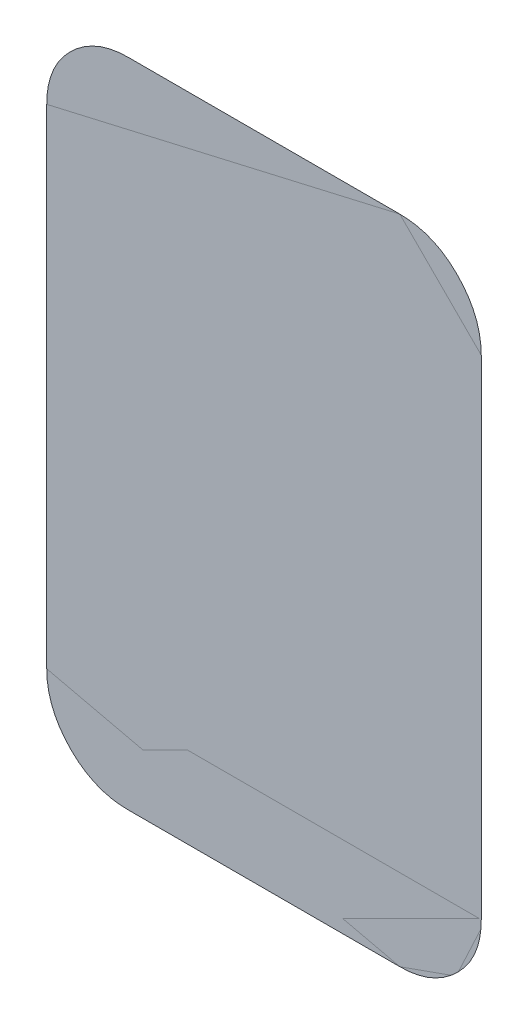
ISO-10303-21;
HEADER;
FILE_DESCRIPTION(('STEP AP214'),'2;1');
FILE_NAME('part.step','',(''),(''),'','','');
FILE_SCHEMA(('AUTOMOTIVE_DESIGN { 1 0 10303 214 1 1 1 1 }'));
ENDSEC;
DATA;
#1=APPLICATION_CONTEXT('core data for automotive mechanical design processes');
#2=APPLICATION_PROTOCOL_DEFINITION('international standard','automotive_design',2000,#1);
#3=PRODUCT_CONTEXT('',#1,'mechanical');
#4=PRODUCT('Part','Part','',(#3));
#5=PRODUCT_RELATED_PRODUCT_CATEGORY('part','',(#4));
#6=PRODUCT_DEFINITION_FORMATION('','',#4);
#7=PRODUCT_DEFINITION_CONTEXT('part definition',#1,'design');
#8=PRODUCT_DEFINITION('design','',#6,#7);
#9=PRODUCT_DEFINITION_SHAPE('','',#8);
#10=(LENGTH_UNIT() NAMED_UNIT(*) SI_UNIT(.MILLI.,.METRE.));
#11=(NAMED_UNIT(*) PLANE_ANGLE_UNIT() SI_UNIT($,.RADIAN.));
#12=(NAMED_UNIT(*) SI_UNIT($,.STERADIAN.) SOLID_ANGLE_UNIT());
#13=UNCERTAINTY_MEASURE_WITH_UNIT(LENGTH_MEASURE(1.E-05),#10,'distance_accuracy_value','');
#14=(GEOMETRIC_REPRESENTATION_CONTEXT(3) GLOBAL_UNCERTAINTY_ASSIGNED_CONTEXT((#13)) GLOBAL_UNIT_ASSIGNED_CONTEXT((#10,
#11,#12)) REPRESENTATION_CONTEXT('',''));
#15=CARTESIAN_POINT('',(0.,0.,0.));
#16=DIRECTION('',(0.,0.,1.));
#17=DIRECTION('',(1.,0.,0.));
#18=AXIS2_PLACEMENT_3D('',#15,#16,#17);
#19=CARTESIAN_POINT('',(15.410999937155,32.749999730201,0.0127));
#20=DIRECTION('',(0.,0.,1.));
#21=DIRECTION('',(1.,0.,0.));
#22=AXIS2_PLACEMENT_3D('',#19,#20,#21);
#23=PLANE('',#22);
#24=CARTESIAN_POINT('',(15.919000244141,33.321499023437,0.0128));
#25=CARTESIAN_POINT('',(15.9189946891649,33.3994216710256,0.0128));
#26=CARTESIAN_POINT('',(15.8631999653755,33.4561992329535,0.0128));
#27=CARTESIAN_POINT('',(15.8083712029976,33.5119938178159,0.0128));
#28=CARTESIAN_POINT('',(15.728499755859,33.511999511719,0.0128));
#29=B_SPLINE_CURVE_WITH_KNOTS('',2,(#24,#25,#26,#27,#28),.UNSPECIFIED.,.F.,.F.,(3,2,3),(0.,0.5,
1.),.UNSPECIFIED.);
#30=CARTESIAN_POINT('',(15.919000244141,33.321499023437,0.01275));
#31=VERTEX_POINT('',#30);
#32=CARTESIAN_POINT('',(15.728499755859,33.511999511719,0.01275));
#33=VERTEX_POINT('',#32);
#34=EDGE_CURVE('E74',#31,#33,#29,.T.);
#35=ORIENTED_EDGE('',*,*,#34,.F.);
#36=CARTESIAN_POINT('',(15.919000244141,32.178498535156,0.0128));
#37=DIRECTION('',(0.,1.,0.));
#38=VECTOR('',#37,1.);
#39=LINE('',#36,#38);
#40=CARTESIAN_POINT('',(15.919000244141,32.178498535156,0.01275));
#41=VERTEX_POINT('',#40);
#42=EDGE_CURVE('E69',#41,#31,#39,.T.);
#43=ORIENTED_EDGE('',*,*,#42,.F.);
#44=CARTESIAN_POINT('',(15.728499755859,31.988000488281,0.0128));
#45=CARTESIAN_POINT('',(15.8064216986689,31.9880060432884,0.0128));
#46=CARTESIAN_POINT('',(15.863199102215,32.043799903928,0.0128));
#47=CARTESIAN_POINT('',(15.9189935265977,32.0986278133435,0.0128));
#48=CARTESIAN_POINT('',(15.919000244141,32.178498535156,0.0128));
#49=B_SPLINE_CURVE_WITH_KNOTS('',2,(#44,#45,#46,#47,#48),.UNSPECIFIED.,.F.,.F.,(3,2,3),(0.,0.5,
1.),.UNSPECIFIED.);
#50=CARTESIAN_POINT('',(15.728499755859,31.988000488281,0.01275));
#51=VERTEX_POINT('',#50);
#52=EDGE_CURVE('E11',#51,#41,#49,.T.);
#53=ORIENTED_EDGE('',*,*,#52,.F.);
#54=CARTESIAN_POINT('',(15.093499755859,31.988000488281,0.0128));
#55=DIRECTION('',(1.,0.,0.));
#56=VECTOR('',#55,1.);
#57=LINE('',#54,#56);
#58=CARTESIAN_POINT('',(15.093499755859,31.988000488281,0.01275));
#59=VERTEX_POINT('',#58);
#60=EDGE_CURVE('E29',#59,#51,#57,.T.);
#61=ORIENTED_EDGE('',*,*,#60,.F.);
#62=CARTESIAN_POINT('',(14.902999267578,32.178498535156,0.0128));
#63=CARTESIAN_POINT('',(14.9030058211753,32.1005765924085,0.0128));
#64=CARTESIAN_POINT('',(14.958800409473,32.0437999038965,0.0128));
#65=CARTESIAN_POINT('',(15.0136290339469,31.9880061821705,0.0128));
#66=CARTESIAN_POINT('',(15.093499755859,31.988000488281,0.0128));
#67=B_SPLINE_CURVE_WITH_KNOTS('',2,(#62,#63,#64,#65,#66),.UNSPECIFIED.,.F.,.F.,(3,2,3),(0.,0.5,
1.),.UNSPECIFIED.);
#68=CARTESIAN_POINT('',(14.902999267578,32.178498535156,0.01275));
#69=VERTEX_POINT('',#68);
#70=EDGE_CURVE('E168',#69,#59,#67,.T.);
#71=ORIENTED_EDGE('',*,*,#70,.F.);
#72=CARTESIAN_POINT('',(14.902999267578,33.321499023437,0.0128));
#73=DIRECTION('',(0.,-1.,0.));
#74=VECTOR('',#73,1.);
#75=LINE('',#72,#74);
#76=CARTESIAN_POINT('',(14.902999267578,33.321499023437,0.01275));
#77=VERTEX_POINT('',#76);
#78=EDGE_CURVE('E156',#77,#69,#75,.T.);
#79=ORIENTED_EDGE('',*,*,#78,.F.);
#80=CARTESIAN_POINT('',(15.093499755859,33.511999511719,0.0128));
#81=CARTESIAN_POINT('',(15.0155777170254,33.5119924774332,0.0128));
#82=CARTESIAN_POINT('',(14.9588006056025,33.4561981736945,0.0128));
#83=CARTESIAN_POINT('',(14.9030064777863,33.4013698381875,0.0128));
#84=CARTESIAN_POINT('',(14.902999267578,33.321499023437,0.0128));
#85=B_SPLINE_CURVE_WITH_KNOTS('',2,(#80,#81,#82,#83,#84),.UNSPECIFIED.,.F.,.F.,(3,2,3),(0.,0.5,
1.),.UNSPECIFIED.);
#86=CARTESIAN_POINT('',(15.093499755859,33.511999511719,0.01275));
#87=VERTEX_POINT('',#86);
#88=EDGE_CURVE('E149',#87,#77,#85,.T.);
#89=ORIENTED_EDGE('',*,*,#88,.F.);
#90=CARTESIAN_POINT('',(15.728499755859,33.511999511719,0.0128));
#91=DIRECTION('',(-1.,0.,0.));
#92=VECTOR('',#91,1.);
#93=LINE('',#90,#92);
#94=EDGE_CURVE('E147',#33,#87,#93,.T.);
#95=ORIENTED_EDGE('',*,*,#94,.F.);
#96=EDGE_LOOP('',(#35,#43,#53,#61,#71,#79,#89,#95));
#97=FACE_BOUND('',#96,.T.);
#98=ADVANCED_FACE('F17',(#97),#23,.F.);
#99=CARTESIAN_POINT('',(15.410999937155,32.749999730201,0.0128));
#100=DIRECTION('',(0.,0.,1.));
#101=DIRECTION('',(1.,0.,0.));
#102=AXIS2_PLACEMENT_3D('',#99,#100,#101);
#103=PLANE('',#102);
#104=ORIENTED_EDGE('',*,*,#42,.T.);
#105=ORIENTED_EDGE('',*,*,#34,.T.);
#106=ORIENTED_EDGE('',*,*,#94,.T.);
#107=ORIENTED_EDGE('',*,*,#88,.T.);
#108=ORIENTED_EDGE('',*,*,#78,.T.);
#109=ORIENTED_EDGE('',*,*,#70,.T.);
#110=ORIENTED_EDGE('',*,*,#60,.T.);
#111=ORIENTED_EDGE('',*,*,#52,.T.);
#112=EDGE_LOOP('',(#104,#105,#106,#107,#108,#109,#110,#111));
#113=FACE_BOUND('',#112,.T.);
#114=ADVANCED_FACE('F67',(#113),#103,.T.);
#115=CLOSED_SHELL('',(#98,#114));
#116=MANIFOLD_SOLID_BREP('B1',#115);
#117=ADVANCED_BREP_SHAPE_REPRESENTATION('',(#18,#116),#14);
#118=SHAPE_DEFINITION_REPRESENTATION(#9,#117);
ENDSEC;
END-ISO-10303-21;
